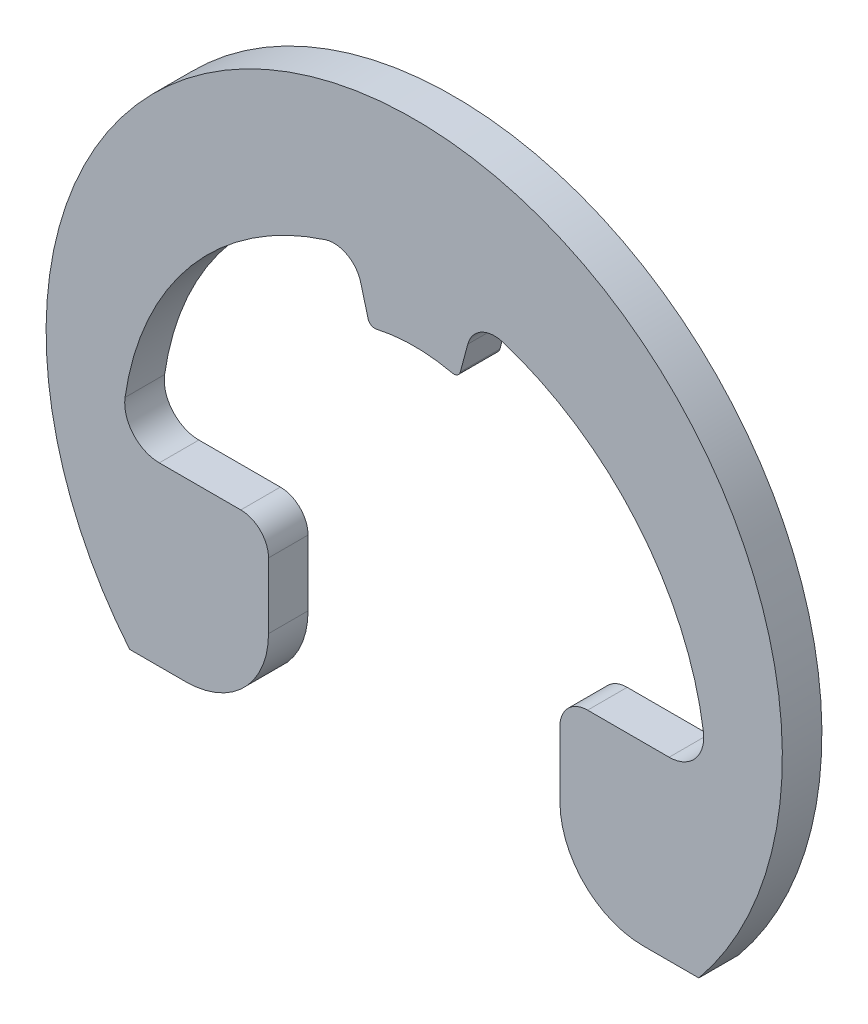
ISO-10303-21;
HEADER;
FILE_DESCRIPTION(('STEP AP214'),'2;1');
FILE_NAME('part.step','',(''),(''),'','','');
FILE_SCHEMA(('AUTOMOTIVE_DESIGN { 1 0 10303 214 1 1 1 1 }'));
ENDSEC;
DATA;
#1=APPLICATION_CONTEXT('core data for automotive mechanical design processes');
#2=APPLICATION_PROTOCOL_DEFINITION('international standard','automotive_design',2000,#1);
#3=PRODUCT_CONTEXT('',#1,'mechanical');
#4=PRODUCT('Part','Part','',(#3));
#5=PRODUCT_RELATED_PRODUCT_CATEGORY('part','',(#4));
#6=PRODUCT_DEFINITION_FORMATION('','',#4);
#7=PRODUCT_DEFINITION_CONTEXT('part definition',#1,'design');
#8=PRODUCT_DEFINITION('design','',#6,#7);
#9=PRODUCT_DEFINITION_SHAPE('','',#8);
#10=(LENGTH_UNIT() NAMED_UNIT(*) SI_UNIT(.MILLI.,.METRE.));
#11=(NAMED_UNIT(*) PLANE_ANGLE_UNIT() SI_UNIT($,.RADIAN.));
#12=(NAMED_UNIT(*) SI_UNIT($,.STERADIAN.) SOLID_ANGLE_UNIT());
#13=UNCERTAINTY_MEASURE_WITH_UNIT(LENGTH_MEASURE(1.E-05),#10,'distance_accuracy_value','');
#14=(GEOMETRIC_REPRESENTATION_CONTEXT(3) GLOBAL_UNCERTAINTY_ASSIGNED_CONTEXT((#13)) GLOBAL_UNIT_ASSIGNED_CONTEXT((#10,
#11,#12)) REPRESENTATION_CONTEXT('',''));
#15=CARTESIAN_POINT('',(0.,0.,0.));
#16=DIRECTION('',(0.,0.,1.));
#17=DIRECTION('',(1.,0.,0.));
#18=AXIS2_PLACEMENT_3D('',#15,#16,#17);
#19=CARTESIAN_POINT('',(-8.375,0.,0.450000000000002));
#20=DIRECTION('',(0.,0.,1.));
#21=DIRECTION('',(1.,0.,0.));
#22=AXIS2_PLACEMENT_3D('',#19,#20,#21);
#23=PLANE('',#22);
#24=CARTESIAN_POINT('',(0.,0.,0.450000000000002));
#25=DIRECTION('',(0.,0.,-1.));
#26=DIRECTION('',(-1.,0.,0.));
#27=AXIS2_PLACEMENT_3D('',#24,#25,#26);
#28=CIRCLE('',#27,3.9);
#29=CARTESIAN_POINT('',(-0.862405574002125,3.80345325013074,0.450000000000002));
#30=VERTEX_POINT('',#29);
#31=CARTESIAN_POINT('',(0.862405574002125,3.80345325013074,0.450000000000002));
#32=VERTEX_POINT('',#31);
#33=EDGE_CURVE('E322',#30,#32,#28,.T.);
#34=ORIENTED_EDGE('',*,*,#33,.T.);
#35=CARTESIAN_POINT('',(0.897233491413749,3.95705424677063,0.450000000000001));
#36=DIRECTION('',(0.,0.,1.));
#37=DIRECTION('',(1.,0.,0.));
#38=AXIS2_PLACEMENT_3D('',#35,#36,#37);
#39=CIRCLE('',#38,0.1575);
#40=CARTESIAN_POINT('',(1.04936680905428,3.91629024716699,0.450000000000002));
#41=VERTEX_POINT('',#40);
#42=EDGE_CURVE('E303',#32,#41,#39,.T.);
#43=ORIENTED_EDGE('',*,*,#42,.T.);
#44=DIRECTION('',(0.258819045102521,0.965925826289068,0.));
#45=VECTOR('',#44,1.);
#46=CARTESIAN_POINT('',(1.38111197343501,5.15438005580115,0.450000000000002));
#47=LINE('',#46,#45);
#48=CARTESIAN_POINT('',(1.2187214963885,4.54833054479825,0.450000000000002));
#49=VERTEX_POINT('',#48);
#50=EDGE_CURVE('E320',#41,#49,#47,.T.);
#51=ORIENTED_EDGE('',*,*,#50,.T.);
#52=CARTESIAN_POINT('',(1.82725476695061,4.38527454638366,0.45));
#53=DIRECTION('',(0.,0.,1.));
#54=DIRECTION('',(1.,0.,0.));
#55=AXIS2_PLACEMENT_3D('',#52,#53,#54);
#56=CIRCLE('',#55,0.63);
#57=CARTESIAN_POINT('',(2.01858591236094,4.98551815759162,0.450000000000002));
#58=VERTEX_POINT('',#57);
#59=EDGE_CURVE('E257',#49,#58,#56,.F.);
#60=ORIENTED_EDGE('',*,*,#59,.T.);
#61=CARTESIAN_POINT('',(0.,-1.34718473283745,0.450000000000002));
#62=DIRECTION('',(0.,0.,-1.));
#63=DIRECTION('',(-1.,0.,0.));
#64=AXIS2_PLACEMENT_3D('',#61,#62,#63);
#65=CIRCLE('',#64,6.6466393752054);
#66=CARTESIAN_POINT('',(6.57884872414697,-0.400313860531958,0.450000000000002));
#67=VERTEX_POINT('',#66);
#68=EDGE_CURVE('E325',#58,#67,#65,.T.);
#69=ORIENTED_EDGE('',*,*,#68,.T.);
#70=CARTESIAN_POINT('',(5.79938062338129,-0.5125,0.45));
#71=DIRECTION('',(0.,0.,1.));
#72=DIRECTION('',(1.,0.,0.));
#73=AXIS2_PLACEMENT_3D('',#70,#71,#72);
#74=CIRCLE('',#73,0.7875);
#75=CARTESIAN_POINT('',(5.79938062338129,-1.3,0.450000000000002));
#76=VERTEX_POINT('',#75);
#77=EDGE_CURVE('E272',#67,#76,#74,.F.);
#78=ORIENTED_EDGE('',*,*,#77,.T.);
#79=DIRECTION('',(-1.,0.,0.));
#80=VECTOR('',#79,1.);
#81=CARTESIAN_POINT('',(6.64647189003443,-1.3,0.450000000000002));
#82=LINE('',#81,#80);
#83=CARTESIAN_POINT('',(3.945,-1.3,0.450000000000002));
#84=VERTEX_POINT('',#83);
#85=EDGE_CURVE('E328',#76,#84,#82,.T.);
#86=ORIENTED_EDGE('',*,*,#85,.T.);
#87=CARTESIAN_POINT('',(3.945,-1.93,0.45));
#88=DIRECTION('',(0.,0.,1.));
#89=DIRECTION('',(1.,0.,0.));
#90=AXIS2_PLACEMENT_3D('',#87,#88,#89);
#91=CIRCLE('',#90,0.63);
#92=CARTESIAN_POINT('',(3.315,-1.93,0.450000000000002));
#93=VERTEX_POINT('',#92);
#94=EDGE_CURVE('E227',#84,#93,#91,.T.);
#95=ORIENTED_EDGE('',*,*,#94,.T.);
#96=DIRECTION('',(0.,-1.,0.));
#97=VECTOR('',#96,1.);
#98=CARTESIAN_POINT('',(3.315,-1.3,0.450000000000002));
#99=LINE('',#98,#97);
#100=CARTESIAN_POINT('',(3.315,-3.4225,0.450000000000002));
#101=VERTEX_POINT('',#100);
#102=EDGE_CURVE('E335',#93,#101,#99,.T.);
#103=ORIENTED_EDGE('',*,*,#102,.T.);
#104=CARTESIAN_POINT('',(5.205,-3.4225,0.45));
#105=DIRECTION('',(0.,0.,1.));
#106=DIRECTION('',(1.,0.,0.));
#107=AXIS2_PLACEMENT_3D('',#104,#105,#106);
#108=CIRCLE('',#107,1.89);
#109=CARTESIAN_POINT('',(5.205,-5.3125,0.450000000000002));
#110=VERTEX_POINT('',#109);
#111=EDGE_CURVE('E285',#101,#110,#108,.T.);
#112=ORIENTED_EDGE('',*,*,#111,.T.);
#113=DIRECTION('',(1.,0.,0.));
#114=VECTOR('',#113,1.);
#115=CARTESIAN_POINT('',(3.315,-5.3125,0.450000000000002));
#116=LINE('',#115,#114);
#117=CARTESIAN_POINT('',(6.47440875679008,-5.3125,0.450000000000002));
#118=VERTEX_POINT('',#117);
#119=EDGE_CURVE('E217',#110,#118,#116,.T.);
#120=ORIENTED_EDGE('',*,*,#119,.T.);
#121=CARTESIAN_POINT('',(0.,0.,0.45));
#122=DIRECTION('',(0.,0.,-1.));
#123=DIRECTION('',(-1.,0.,0.));
#124=AXIS2_PLACEMENT_3D('',#121,#122,#123);
#125=CIRCLE('',#124,8.375);
#126=CARTESIAN_POINT('',(-6.47440875679008,-5.3125,0.450000000000002));
#127=VERTEX_POINT('',#126);
#128=EDGE_CURVE('E209',#127,#118,#125,.T.);
#129=ORIENTED_EDGE('',*,*,#128,.F.);
#130=DIRECTION('',(1.,0.,0.));
#131=VECTOR('',#130,1.);
#132=CARTESIAN_POINT('',(-3.315,-5.3125,0.450000000000002));
#133=LINE('',#132,#131);
#134=CARTESIAN_POINT('',(-5.205,-5.3125,0.450000000000002));
#135=VERTEX_POINT('',#134);
#136=EDGE_CURVE('E192',#127,#135,#133,.T.);
#137=ORIENTED_EDGE('',*,*,#136,.T.);
#138=CARTESIAN_POINT('',(-5.205,-3.4225,0.450000000000002));
#139=DIRECTION('',(0.,0.,1.));
#140=DIRECTION('',(1.,0.,0.));
#141=AXIS2_PLACEMENT_3D('',#138,#139,#140);
#142=CIRCLE('',#141,1.89);
#143=CARTESIAN_POINT('',(-3.315,-3.4225,0.450000000000002));
#144=VERTEX_POINT('',#143);
#145=EDGE_CURVE('E283',#135,#144,#142,.T.);
#146=ORIENTED_EDGE('',*,*,#145,.T.);
#147=DIRECTION('',(0.,1.,0.));
#148=VECTOR('',#147,1.);
#149=CARTESIAN_POINT('',(-3.315,-2.05445248180628,0.450000000000002));
#150=LINE('',#149,#148);
#151=CARTESIAN_POINT('',(-3.315,-1.93,0.450000000000002));
#152=VERTEX_POINT('',#151);
#153=EDGE_CURVE('E202',#144,#152,#150,.T.);
#154=ORIENTED_EDGE('',*,*,#153,.T.);
#155=CARTESIAN_POINT('',(-3.945,-1.93,0.450000000000001));
#156=DIRECTION('',(0.,0.,1.));
#157=DIRECTION('',(1.,0.,0.));
#158=AXIS2_PLACEMENT_3D('',#155,#156,#157);
#159=CIRCLE('',#158,0.63);
#160=CARTESIAN_POINT('',(-3.945,-1.3,0.450000000000002));
#161=VERTEX_POINT('',#160);
#162=EDGE_CURVE('E222',#152,#161,#159,.T.);
#163=ORIENTED_EDGE('',*,*,#162,.T.);
#164=DIRECTION('',(-1.,0.,0.));
#165=VECTOR('',#164,1.);
#166=CARTESIAN_POINT('',(-3.67695526217005,-1.3,0.450000000000002));
#167=LINE('',#166,#165);
#168=CARTESIAN_POINT('',(-5.79938062338129,-1.3,0.450000000000002));
#169=VERTEX_POINT('',#168);
#170=EDGE_CURVE('E374',#161,#169,#167,.T.);
#171=ORIENTED_EDGE('',*,*,#170,.T.);
#172=CARTESIAN_POINT('',(-5.79938062338129,-0.5125,0.450000000000002));
#173=DIRECTION('',(0.,0.,1.));
#174=DIRECTION('',(1.,0.,0.));
#175=AXIS2_PLACEMENT_3D('',#172,#173,#174);
#176=CIRCLE('',#175,0.7875);
#177=CARTESIAN_POINT('',(-6.57884872414697,-0.400313860531958,0.450000000000002));
#178=VERTEX_POINT('',#177);
#179=EDGE_CURVE('E276',#169,#178,#176,.F.);
#180=ORIENTED_EDGE('',*,*,#179,.T.);
#181=CARTESIAN_POINT('',(0.,-1.34718473283745,0.450000000000002));
#182=DIRECTION('',(0.,0.,-1.));
#183=DIRECTION('',(1.,0.,0.));
#184=AXIS2_PLACEMENT_3D('',#181,#182,#183);
#185=CIRCLE('',#184,6.6466393752054);
#186=CARTESIAN_POINT('',(-2.01858591236094,4.98551815759162,0.450000000000002));
#187=VERTEX_POINT('',#186);
#188=EDGE_CURVE('E377',#178,#187,#185,.T.);
#189=ORIENTED_EDGE('',*,*,#188,.T.);
#190=CARTESIAN_POINT('',(-1.82725476695061,4.38527454638366,0.450000000000001));
#191=DIRECTION('',(0.,0.,1.));
#192=DIRECTION('',(1.,0.,0.));
#193=AXIS2_PLACEMENT_3D('',#190,#191,#192);
#194=CIRCLE('',#193,0.63);
#195=CARTESIAN_POINT('',(-1.2187214963885,4.54833054479825,0.450000000000002));
#196=VERTEX_POINT('',#195);
#197=EDGE_CURVE('E252',#187,#196,#194,.F.);
#198=ORIENTED_EDGE('',*,*,#197,.T.);
#199=DIRECTION('',(0.258819045102521,-0.965925826289068,0.));
#200=VECTOR('',#199,1.);
#201=CARTESIAN_POINT('',(-1.38111197343501,5.15438005580115,0.450000000000002));
#202=LINE('',#201,#200);
#203=CARTESIAN_POINT('',(-1.04936680905428,3.91629024716699,0.450000000000002));
#204=VERTEX_POINT('',#203);
#205=EDGE_CURVE('E330',#196,#204,#202,.T.);
#206=ORIENTED_EDGE('',*,*,#205,.T.);
#207=CARTESIAN_POINT('',(-0.897233491413749,3.95705424677063,0.450000000000001));
#208=DIRECTION('',(0.,0.,1.));
#209=DIRECTION('',(1.,0.,0.));
#210=AXIS2_PLACEMENT_3D('',#207,#208,#209);
#211=CIRCLE('',#210,0.1575);
#212=EDGE_CURVE('E301',#204,#30,#211,.T.);
#213=ORIENTED_EDGE('',*,*,#212,.T.);
#214=EDGE_LOOP('',(#34,#43,#51,#60,#69,#78,#86,#95,#103,#112,#120,#129,#137,#146,#154,#163,#171,
#180,#189,#198,#206,#213));
#215=FACE_BOUND('',#214,.T.);
#216=ADVANCED_FACE('F40',(#215),#23,.T.);
#217=CARTESIAN_POINT('',(0.,0.,-0.450000000000002));
#218=DIRECTION('',(0.,0.,-1.));
#219=DIRECTION('',(-1.,0.,0.));
#220=AXIS2_PLACEMENT_3D('',#217,#218,#219);
#221=CYLINDRICAL_SURFACE('',#220,8.375);
#222=ORIENTED_EDGE('',*,*,#128,.T.);
#223=DIRECTION('',(0.,0.,1.));
#224=VECTOR('',#223,1.);
#225=CARTESIAN_POINT('',(6.47440875679008,-5.3125,-0.449999999999998));
#226=LINE('',#225,#224);
#227=CARTESIAN_POINT('',(6.47440875679008,-5.3125,-0.449999999999998));
#228=VERTEX_POINT('',#227);
#229=EDGE_CURVE('E212',#228,#118,#226,.T.);
#230=ORIENTED_EDGE('',*,*,#229,.F.);
#231=CARTESIAN_POINT('',(0.,0.,-0.45));
#232=DIRECTION('',(0.,0.,-1.));
#233=DIRECTION('',(-1.,0.,0.));
#234=AXIS2_PLACEMENT_3D('',#231,#232,#233);
#235=CIRCLE('',#234,8.375);
#236=CARTESIAN_POINT('',(-6.47440875679008,-5.3125,-0.449999999999999));
#237=VERTEX_POINT('',#236);
#238=EDGE_CURVE('E211',#237,#228,#235,.T.);
#239=ORIENTED_EDGE('',*,*,#238,.F.);
#240=DIRECTION('',(0.,0.,1.));
#241=VECTOR('',#240,1.);
#242=CARTESIAN_POINT('',(-6.47440875679008,-5.3125,-0.449999999999998));
#243=LINE('',#242,#241);
#244=EDGE_CURVE('E196',#237,#127,#243,.T.);
#245=ORIENTED_EDGE('',*,*,#244,.T.);
#246=EDGE_LOOP('',(#222,#230,#239,#245));
#247=FACE_BOUND('',#246,.T.);
#248=ADVANCED_FACE('F207',(#247),#221,.T.);
#249=CARTESIAN_POINT('',(-8.375,0.,-0.449999999999999));
#250=DIRECTION('',(0.,0.,-1.));
#251=DIRECTION('',(-1.,0.,0.));
#252=AXIS2_PLACEMENT_3D('',#249,#250,#251);
#253=PLANE('',#252);
#254=DIRECTION('',(0.258819045102521,0.965925826289068,0.));
#255=VECTOR('',#254,1.);
#256=CARTESIAN_POINT('',(1.38111197343501,5.15438005580115,-0.449999999999998));
#257=LINE('',#256,#255);
#258=CARTESIAN_POINT('',(1.04936680905428,3.91629024716699,-0.449999999999998));
#259=VERTEX_POINT('',#258);
#260=CARTESIAN_POINT('',(1.2187214963885,4.54833054479825,-0.449999999999998));
#261=VERTEX_POINT('',#260);
#262=EDGE_CURVE('E310',#259,#261,#257,.T.);
#263=ORIENTED_EDGE('',*,*,#262,.F.);
#264=CARTESIAN_POINT('',(0.897233491413749,3.95705424677063,-0.450000000000001));
#265=DIRECTION('',(0.,0.,-1.));
#266=DIRECTION('',(-1.,0.,0.));
#267=AXIS2_PLACEMENT_3D('',#264,#265,#266);
#268=CIRCLE('',#267,0.1575);
#269=CARTESIAN_POINT('',(0.862405574002125,3.80345325013074,-0.449999999999998));
#270=VERTEX_POINT('',#269);
#271=EDGE_CURVE('E48',#259,#270,#268,.T.);
#272=ORIENTED_EDGE('',*,*,#271,.T.);
#273=CARTESIAN_POINT('',(0.,0.,-0.449999999999998));
#274=DIRECTION('',(0.,0.,-1.));
#275=DIRECTION('',(-1.,0.,0.));
#276=AXIS2_PLACEMENT_3D('',#273,#274,#275);
#277=CIRCLE('',#276,3.9);
#278=CARTESIAN_POINT('',(-0.862405574002125,3.80345325013074,-0.449999999999998));
#279=VERTEX_POINT('',#278);
#280=EDGE_CURVE('E309',#279,#270,#277,.T.);
#281=ORIENTED_EDGE('',*,*,#280,.F.);
#282=CARTESIAN_POINT('',(-0.897233491413749,3.95705424677063,-0.450000000000001));
#283=DIRECTION('',(0.,0.,-1.));
#284=DIRECTION('',(-1.,0.,0.));
#285=AXIS2_PLACEMENT_3D('',#282,#283,#284);
#286=CIRCLE('',#285,0.1575);
#287=CARTESIAN_POINT('',(-1.04936680905428,3.91629024716699,-0.449999999999998));
#288=VERTEX_POINT('',#287);
#289=EDGE_CURVE('E55',#279,#288,#286,.T.);
#290=ORIENTED_EDGE('',*,*,#289,.T.);
#291=DIRECTION('',(0.258819045102521,-0.965925826289068,0.));
#292=VECTOR('',#291,1.);
#293=CARTESIAN_POINT('',(-1.38111197343501,5.15438005580115,-0.449999999999998));
#294=LINE('',#293,#292);
#295=CARTESIAN_POINT('',(-1.2187214963885,4.54833054479825,-0.449999999999998));
#296=VERTEX_POINT('',#295);
#297=EDGE_CURVE('E317',#296,#288,#294,.T.);
#298=ORIENTED_EDGE('',*,*,#297,.F.);
#299=CARTESIAN_POINT('',(-1.82725476695061,4.38527454638366,-0.45));
#300=DIRECTION('',(0.,0.,-1.));
#301=DIRECTION('',(-1.,0.,0.));
#302=AXIS2_PLACEMENT_3D('',#299,#300,#301);
#303=CIRCLE('',#302,0.63);
#304=CARTESIAN_POINT('',(-2.01858591236094,4.98551815759162,-0.449999999999998));
#305=VERTEX_POINT('',#304);
#306=EDGE_CURVE('E254',#296,#305,#303,.F.);
#307=ORIENTED_EDGE('',*,*,#306,.T.);
#308=CARTESIAN_POINT('',(0.,-1.34718473283745,-0.449999999999998));
#309=DIRECTION('',(0.,0.,-1.));
#310=DIRECTION('',(1.,0.,0.));
#311=AXIS2_PLACEMENT_3D('',#308,#309,#310);
#312=CIRCLE('',#311,6.6466393752054);
#313=CARTESIAN_POINT('',(-6.57884872414697,-0.400313860531958,-0.449999999999998));
#314=VERTEX_POINT('',#313);
#315=EDGE_CURVE('E346',#314,#305,#312,.T.);
#316=ORIENTED_EDGE('',*,*,#315,.F.);
#317=CARTESIAN_POINT('',(-5.79938062338129,-0.5125,-0.45));
#318=DIRECTION('',(0.,0.,-1.));
#319=DIRECTION('',(-1.,0.,0.));
#320=AXIS2_PLACEMENT_3D('',#317,#318,#319);
#321=CIRCLE('',#320,0.7875);
#322=CARTESIAN_POINT('',(-5.79938062338129,-1.3,-0.449999999999998));
#323=VERTEX_POINT('',#322);
#324=EDGE_CURVE('E278',#314,#323,#321,.F.);
#325=ORIENTED_EDGE('',*,*,#324,.T.);
#326=DIRECTION('',(-1.,0.,0.));
#327=VECTOR('',#326,1.);
#328=CARTESIAN_POINT('',(-3.67695526217005,-1.3,-0.449999999999998));
#329=LINE('',#328,#327);
#330=CARTESIAN_POINT('',(-3.945,-1.3,-0.449999999999998));
#331=VERTEX_POINT('',#330);
#332=EDGE_CURVE('E343',#331,#323,#329,.T.);
#333=ORIENTED_EDGE('',*,*,#332,.F.);
#334=CARTESIAN_POINT('',(-3.945,-1.93,-0.45));
#335=DIRECTION('',(0.,0.,-1.));
#336=DIRECTION('',(-1.,0.,0.));
#337=AXIS2_PLACEMENT_3D('',#334,#335,#336);
#338=CIRCLE('',#337,0.63);
#339=CARTESIAN_POINT('',(-3.315,-1.93,-0.449999999999998));
#340=VERTEX_POINT('',#339);
#341=EDGE_CURVE('E231',#331,#340,#338,.T.);
#342=ORIENTED_EDGE('',*,*,#341,.T.);
#343=DIRECTION('',(0.,1.,0.));
#344=VECTOR('',#343,1.);
#345=CARTESIAN_POINT('',(-3.315,-2.05445248180628,-0.449999999999998));
#346=LINE('',#345,#344);
#347=CARTESIAN_POINT('',(-3.315,-3.4225,-0.449999999999998));
#348=VERTEX_POINT('',#347);
#349=EDGE_CURVE('E341',#348,#340,#346,.T.);
#350=ORIENTED_EDGE('',*,*,#349,.F.);
#351=CARTESIAN_POINT('',(-5.205,-3.4225,-0.45));
#352=DIRECTION('',(0.,0.,-1.));
#353=DIRECTION('',(-1.,0.,0.));
#354=AXIS2_PLACEMENT_3D('',#351,#352,#353);
#355=CIRCLE('',#354,1.89);
#356=CARTESIAN_POINT('',(-5.205,-5.3125,-0.449999999999998));
#357=VERTEX_POINT('',#356);
#358=EDGE_CURVE('E289',#348,#357,#355,.T.);
#359=ORIENTED_EDGE('',*,*,#358,.T.);
#360=DIRECTION('',(1.,0.,0.));
#361=VECTOR('',#360,1.);
#362=CARTESIAN_POINT('',(-3.315,-5.3125,-0.449999999999998));
#363=LINE('',#362,#361);
#364=EDGE_CURVE('E339',#237,#357,#363,.T.);
#365=ORIENTED_EDGE('',*,*,#364,.F.);
#366=ORIENTED_EDGE('',*,*,#238,.T.);
#367=DIRECTION('',(1.,0.,0.));
#368=VECTOR('',#367,1.);
#369=CARTESIAN_POINT('',(3.315,-5.3125,-0.449999999999998));
#370=LINE('',#369,#368);
#371=CARTESIAN_POINT('',(5.205,-5.3125,-0.449999999999998));
#372=VERTEX_POINT('',#371);
#373=EDGE_CURVE('E213',#372,#228,#370,.T.);
#374=ORIENTED_EDGE('',*,*,#373,.F.);
#375=CARTESIAN_POINT('',(5.205,-3.4225,-0.450000000000002));
#376=DIRECTION('',(0.,0.,-1.));
#377=DIRECTION('',(-1.,0.,0.));
#378=AXIS2_PLACEMENT_3D('',#375,#376,#377);
#379=CIRCLE('',#378,1.89);
#380=CARTESIAN_POINT('',(3.315,-3.4225,-0.449999999999998));
#381=VERTEX_POINT('',#380);
#382=EDGE_CURVE('E291',#372,#381,#379,.T.);
#383=ORIENTED_EDGE('',*,*,#382,.T.);
#384=DIRECTION('',(0.,-1.,0.));
#385=VECTOR('',#384,1.);
#386=CARTESIAN_POINT('',(3.315,-1.3,-0.449999999999998));
#387=LINE('',#386,#385);
#388=CARTESIAN_POINT('',(3.315,-1.93,-0.449999999999998));
#389=VERTEX_POINT('',#388);
#390=EDGE_CURVE('E355',#389,#381,#387,.T.);
#391=ORIENTED_EDGE('',*,*,#390,.F.);
#392=CARTESIAN_POINT('',(3.945,-1.93,-0.450000000000002));
#393=DIRECTION('',(0.,0.,-1.));
#394=DIRECTION('',(-1.,0.,0.));
#395=AXIS2_PLACEMENT_3D('',#392,#393,#394);
#396=CIRCLE('',#395,0.63);
#397=CARTESIAN_POINT('',(3.945,-1.3,-0.449999999999998));
#398=VERTEX_POINT('',#397);
#399=EDGE_CURVE('E234',#389,#398,#396,.T.);
#400=ORIENTED_EDGE('',*,*,#399,.T.);
#401=DIRECTION('',(-1.,0.,0.));
#402=VECTOR('',#401,1.);
#403=CARTESIAN_POINT('',(6.64647189003443,-1.3,-0.449999999999998));
#404=LINE('',#403,#402);
#405=CARTESIAN_POINT('',(5.79938062338129,-1.3,-0.449999999999998));
#406=VERTEX_POINT('',#405);
#407=EDGE_CURVE('E353',#406,#398,#404,.T.);
#408=ORIENTED_EDGE('',*,*,#407,.F.);
#409=CARTESIAN_POINT('',(5.79938062338129,-0.5125,-0.450000000000002));
#410=DIRECTION('',(0.,0.,-1.));
#411=DIRECTION('',(-1.,0.,0.));
#412=AXIS2_PLACEMENT_3D('',#409,#410,#411);
#413=CIRCLE('',#412,0.7875);
#414=CARTESIAN_POINT('',(6.57884872414697,-0.400313860531958,-0.449999999999998));
#415=VERTEX_POINT('',#414);
#416=EDGE_CURVE('E274',#406,#415,#413,.F.);
#417=ORIENTED_EDGE('',*,*,#416,.T.);
#418=CARTESIAN_POINT('',(0.,-1.34718473283745,-0.449999999999998));
#419=DIRECTION('',(0.,0.,-1.));
#420=DIRECTION('',(-1.,0.,0.));
#421=AXIS2_PLACEMENT_3D('',#418,#419,#420);
#422=CIRCLE('',#421,6.6466393752054);
#423=CARTESIAN_POINT('',(2.01858591236094,4.98551815759162,-0.449999999999998));
#424=VERTEX_POINT('',#423);
#425=EDGE_CURVE('E350',#424,#415,#422,.T.);
#426=ORIENTED_EDGE('',*,*,#425,.F.);
#427=CARTESIAN_POINT('',(1.82725476695061,4.38527454638366,-0.450000000000001));
#428=DIRECTION('',(0.,0.,-1.));
#429=DIRECTION('',(-1.,0.,0.));
#430=AXIS2_PLACEMENT_3D('',#427,#428,#429);
#431=CIRCLE('',#430,0.63);
#432=EDGE_CURVE('E259',#424,#261,#431,.F.);
#433=ORIENTED_EDGE('',*,*,#432,.T.);
#434=EDGE_LOOP('',(#263,#272,#281,#290,#298,#307,#316,#325,#333,#342,#350,#359,#365,#366,#374,
#383,#391,#400,#408,#417,#426,#433));
#435=FACE_BOUND('',#434,.T.);
#436=ADVANCED_FACE('F308',(#435),#253,.T.);
#437=CARTESIAN_POINT('',(3.315,-5.3125,-0.449999999999998));
#438=DIRECTION('',(0.,-1.,0.));
#439=DIRECTION('',(0.,0.,-1.));
#440=AXIS2_PLACEMENT_3D('',#437,#438,#439);
#441=PLANE('',#440);
#442=ORIENTED_EDGE('',*,*,#119,.F.);
#443=DIRECTION('',(0.,0.,1.));
#444=VECTOR('',#443,1.);
#445=CARTESIAN_POINT('',(5.205,-5.3125,-0.449999999999998));
#446=LINE('',#445,#444);
#447=EDGE_CURVE('E287',#110,#372,#446,.F.);
#448=ORIENTED_EDGE('',*,*,#447,.T.);
#449=ORIENTED_EDGE('',*,*,#373,.T.);
#450=ORIENTED_EDGE('',*,*,#229,.T.);
#451=EDGE_LOOP('',(#442,#448,#449,#450));
#452=FACE_BOUND('',#451,.T.);
#453=ADVANCED_FACE('F360',(#452),#441,.T.);
#454=CARTESIAN_POINT('',(3.315,-2.05445248180628,-0.449999999999998));
#455=DIRECTION('',(-1.,0.,0.));
#456=DIRECTION('',(0.,-1.,0.));
#457=AXIS2_PLACEMENT_3D('',#454,#455,#456);
#458=PLANE('',#457);
#459=ORIENTED_EDGE('',*,*,#390,.T.);
#460=DIRECTION('',(0.,0.,1.));
#461=VECTOR('',#460,1.);
#462=CARTESIAN_POINT('',(3.315,-3.4225,-0.449999999999998));
#463=LINE('',#462,#461);
#464=EDGE_CURVE('E280',#381,#101,#463,.T.);
#465=ORIENTED_EDGE('',*,*,#464,.T.);
#466=ORIENTED_EDGE('',*,*,#102,.F.);
#467=DIRECTION('',(0.,0.,1.));
#468=VECTOR('',#467,1.);
#469=CARTESIAN_POINT('',(3.315,-1.93,-0.449999999999998));
#470=LINE('',#469,#468);
#471=EDGE_CURVE('E229',#93,#389,#470,.F.);
#472=ORIENTED_EDGE('',*,*,#471,.T.);
#473=EDGE_LOOP('',(#459,#465,#466,#472));
#474=FACE_BOUND('',#473,.T.);
#475=ADVANCED_FACE('F460',(#474),#458,.T.);
#476=CARTESIAN_POINT('',(3.67695526217005,-1.3,-0.449999999999998));
#477=DIRECTION('',(0.,1.,0.));
#478=DIRECTION('',(0.,0.,1.));
#479=AXIS2_PLACEMENT_3D('',#476,#477,#478);
#480=PLANE('',#479);
#481=ORIENTED_EDGE('',*,*,#85,.F.);
#482=DIRECTION('',(0.,0.,-1.));
#483=VECTOR('',#482,1.);
#484=CARTESIAN_POINT('',(5.79938062338129,-1.3,-0.449999999999998));
#485=LINE('',#484,#483);
#486=EDGE_CURVE('E265',#76,#406,#485,.T.);
#487=ORIENTED_EDGE('',*,*,#486,.T.);
#488=ORIENTED_EDGE('',*,*,#407,.T.);
#489=DIRECTION('',(0.,0.,1.));
#490=VECTOR('',#489,1.);
#491=CARTESIAN_POINT('',(3.945,-1.3,-0.449999999999998));
#492=LINE('',#491,#490);
#493=EDGE_CURVE('E219',#398,#84,#492,.T.);
#494=ORIENTED_EDGE('',*,*,#493,.T.);
#495=EDGE_LOOP('',(#481,#487,#488,#494));
#496=FACE_BOUND('',#495,.T.);
#497=ADVANCED_FACE('F464',(#496),#480,.T.);
#498=CARTESIAN_POINT('',(0.,-1.34718473283745,-0.449999999999998));
#499=DIRECTION('',(0.,0.,1.));
#500=DIRECTION('',(1.,0.,0.));
#501=AXIS2_PLACEMENT_3D('',#498,#499,#500);
#502=CYLINDRICAL_SURFACE('',#501,6.6466393752054);
#503=ORIENTED_EDGE('',*,*,#425,.T.);
#504=DIRECTION('',(0.,0.,1.));
#505=VECTOR('',#504,1.);
#506=CARTESIAN_POINT('',(6.57884872414697,-0.400313860531958,-0.449999999999998));
#507=LINE('',#506,#505);
#508=EDGE_CURVE('E262',#415,#67,#507,.T.);
#509=ORIENTED_EDGE('',*,*,#508,.T.);
#510=ORIENTED_EDGE('',*,*,#68,.F.);
#511=DIRECTION('',(0.,0.,1.));
#512=VECTOR('',#511,1.);
#513=CARTESIAN_POINT('',(2.01858591236094,4.98551815759162,-0.449999999999998));
#514=LINE('',#513,#512);
#515=EDGE_CURVE('E250',#58,#424,#514,.F.);
#516=ORIENTED_EDGE('',*,*,#515,.T.);
#517=EDGE_LOOP('',(#503,#509,#510,#516));
#518=FACE_BOUND('',#517,.T.);
#519=ADVANCED_FACE('F502',(#518),#502,.F.);
#520=CARTESIAN_POINT('',(1.38111197343501,5.15438005580115,-0.449999999999998));
#521=DIRECTION('',(0.965925826289068,-0.258819045102521,0.));
#522=DIRECTION('',(0.258819045102521,0.965925826289068,0.));
#523=AXIS2_PLACEMENT_3D('',#520,#521,#522);
#524=PLANE('',#523);
#525=ORIENTED_EDGE('',*,*,#50,.F.);
#526=DIRECTION('',(0.,0.,1.));
#527=VECTOR('',#526,1.);
#528=CARTESIAN_POINT('',(1.04936680905428,3.91629024716699,-0.449999999999998));
#529=LINE('',#528,#527);
#530=EDGE_CURVE('E63',#41,#259,#529,.F.);
#531=ORIENTED_EDGE('',*,*,#530,.T.);
#532=ORIENTED_EDGE('',*,*,#262,.T.);
#533=DIRECTION('',(0.,0.,-1.));
#534=VECTOR('',#533,1.);
#535=CARTESIAN_POINT('',(1.2187214963885,4.54833054479825,0.450000000000002));
#536=LINE('',#535,#534);
#537=EDGE_CURVE('E247',#261,#49,#536,.F.);
#538=ORIENTED_EDGE('',*,*,#537,.T.);
#539=EDGE_LOOP('',(#525,#531,#532,#538));
#540=FACE_BOUND('',#539,.T.);
#541=ADVANCED_FACE('F323',(#540),#524,.T.);
#542=CARTESIAN_POINT('',(0.,0.,-0.449999999999998));
#543=DIRECTION('',(0.,0.,1.));
#544=DIRECTION('',(1.,0.,0.));
#545=AXIS2_PLACEMENT_3D('',#542,#543,#544);
#546=CYLINDRICAL_SURFACE('',#545,3.9);
#547=ORIENTED_EDGE('',*,*,#280,.T.);
#548=DIRECTION('',(0.,0.,1.));
#549=VECTOR('',#548,1.);
#550=CARTESIAN_POINT('',(0.862405574002125,3.80345325013074,-0.449999999999998));
#551=LINE('',#550,#549);
#552=EDGE_CURVE('E298',#270,#32,#551,.T.);
#553=ORIENTED_EDGE('',*,*,#552,.T.);
#554=ORIENTED_EDGE('',*,*,#33,.F.);
#555=DIRECTION('',(0.,0.,1.));
#556=VECTOR('',#555,1.);
#557=CARTESIAN_POINT('',(-0.862405574002125,3.80345325013074,-0.449999999999998));
#558=LINE('',#557,#556);
#559=EDGE_CURVE('E296',#30,#279,#558,.F.);
#560=ORIENTED_EDGE('',*,*,#559,.T.);
#561=EDGE_LOOP('',(#547,#553,#554,#560));
#562=FACE_BOUND('',#561,.T.);
#563=ADVANCED_FACE('F314',(#562),#546,.F.);
#564=CARTESIAN_POINT('',(-1.38111197343501,5.15438005580115,-0.449999999999998));
#565=DIRECTION('',(-0.965925826289068,-0.258819045102521,0.));
#566=DIRECTION('',(0.258819045102521,-0.965925826289068,0.));
#567=AXIS2_PLACEMENT_3D('',#564,#565,#566);
#568=PLANE('',#567);
#569=ORIENTED_EDGE('',*,*,#297,.T.);
#570=DIRECTION('',(0.,0.,1.));
#571=VECTOR('',#570,1.);
#572=CARTESIAN_POINT('',(-1.04936680905428,3.91629024716699,-0.449999999999998));
#573=LINE('',#572,#571);
#574=EDGE_CURVE('E12',#288,#204,#573,.T.);
#575=ORIENTED_EDGE('',*,*,#574,.T.);
#576=ORIENTED_EDGE('',*,*,#205,.F.);
#577=DIRECTION('',(0.,0.,-1.));
#578=VECTOR('',#577,1.);
#579=CARTESIAN_POINT('',(-1.2187214963885,4.54833054479825,-0.449999999999998));
#580=LINE('',#579,#578);
#581=EDGE_CURVE('E245',#196,#296,#580,.T.);
#582=ORIENTED_EDGE('',*,*,#581,.T.);
#583=EDGE_LOOP('',(#569,#575,#576,#582));
#584=FACE_BOUND('',#583,.T.);
#585=ADVANCED_FACE('F385',(#584),#568,.T.);
#586=CARTESIAN_POINT('',(0.,-1.34718473283745,-0.449999999999998));
#587=DIRECTION('',(0.,0.,1.));
#588=DIRECTION('',(1.,0.,0.));
#589=AXIS2_PLACEMENT_3D('',#586,#587,#588);
#590=CYLINDRICAL_SURFACE('',#589,6.6466393752054);
#591=ORIENTED_EDGE('',*,*,#188,.F.);
#592=DIRECTION('',(0.,0.,1.));
#593=VECTOR('',#592,1.);
#594=CARTESIAN_POINT('',(-6.57884872414697,-0.400313860531958,-0.449999999999998));
#595=LINE('',#594,#593);
#596=EDGE_CURVE('E270',#178,#314,#595,.F.);
#597=ORIENTED_EDGE('',*,*,#596,.T.);
#598=ORIENTED_EDGE('',*,*,#315,.T.);
#599=DIRECTION('',(0.,0.,1.));
#600=VECTOR('',#599,1.);
#601=CARTESIAN_POINT('',(-2.01858591236094,4.98551815759162,-0.449999999999998));
#602=LINE('',#601,#600);
#603=EDGE_CURVE('E242',#305,#187,#602,.T.);
#604=ORIENTED_EDGE('',*,*,#603,.T.);
#605=EDGE_LOOP('',(#591,#597,#598,#604));
#606=FACE_BOUND('',#605,.T.);
#607=ADVANCED_FACE('F488',(#606),#590,.F.);
#608=CARTESIAN_POINT('',(-6.64647189003443,-1.3,-0.449999999999998));
#609=DIRECTION('',(0.,1.,0.));
#610=DIRECTION('',(0.,0.,1.));
#611=AXIS2_PLACEMENT_3D('',#608,#609,#610);
#612=PLANE('',#611);
#613=ORIENTED_EDGE('',*,*,#332,.T.);
#614=DIRECTION('',(0.,0.,-1.));
#615=VECTOR('',#614,1.);
#616=CARTESIAN_POINT('',(-5.79938062338129,-1.3,0.450000000000002));
#617=LINE('',#616,#615);
#618=EDGE_CURVE('E267',#323,#169,#617,.F.);
#619=ORIENTED_EDGE('',*,*,#618,.T.);
#620=ORIENTED_EDGE('',*,*,#170,.F.);
#621=DIRECTION('',(0.,0.,1.));
#622=VECTOR('',#621,1.);
#623=CARTESIAN_POINT('',(-3.945,-1.3,-0.449999999999998));
#624=LINE('',#623,#622);
#625=EDGE_CURVE('E240',#161,#331,#624,.F.);
#626=ORIENTED_EDGE('',*,*,#625,.T.);
#627=EDGE_LOOP('',(#613,#619,#620,#626));
#628=FACE_BOUND('',#627,.T.);
#629=ADVANCED_FACE('F455',(#628),#612,.T.);
#630=CARTESIAN_POINT('',(-3.315,-1.3,-0.449999999999998));
#631=DIRECTION('',(1.,0.,0.));
#632=DIRECTION('',(0.,1.,0.));
#633=AXIS2_PLACEMENT_3D('',#630,#631,#632);
#634=PLANE('',#633);
#635=ORIENTED_EDGE('',*,*,#153,.F.);
#636=DIRECTION('',(0.,0.,1.));
#637=VECTOR('',#636,1.);
#638=CARTESIAN_POINT('',(-3.315,-3.4225,-0.449999999999998));
#639=LINE('',#638,#637);
#640=EDGE_CURVE('E294',#144,#348,#639,.F.);
#641=ORIENTED_EDGE('',*,*,#640,.T.);
#642=ORIENTED_EDGE('',*,*,#349,.T.);
#643=DIRECTION('',(0.,0.,1.));
#644=VECTOR('',#643,1.);
#645=CARTESIAN_POINT('',(-3.315,-1.93,-0.449999999999998));
#646=LINE('',#645,#644);
#647=EDGE_CURVE('E237',#340,#152,#646,.T.);
#648=ORIENTED_EDGE('',*,*,#647,.T.);
#649=EDGE_LOOP('',(#635,#641,#642,#648));
#650=FACE_BOUND('',#649,.T.);
#651=ADVANCED_FACE('F372',(#650),#634,.T.);
#652=CARTESIAN_POINT('',(-3.315,-5.3125,-0.449999999999998));
#653=DIRECTION('',(0.,-1.,0.));
#654=DIRECTION('',(0.,0.,-1.));
#655=AXIS2_PLACEMENT_3D('',#652,#653,#654);
#656=PLANE('',#655);
#657=ORIENTED_EDGE('',*,*,#364,.T.);
#658=DIRECTION('',(0.,0.,1.));
#659=VECTOR('',#658,1.);
#660=CARTESIAN_POINT('',(-5.205,-5.3125,-0.449999999999998));
#661=LINE('',#660,#659);
#662=EDGE_CURVE('E199',#357,#135,#661,.T.);
#663=ORIENTED_EDGE('',*,*,#662,.T.);
#664=ORIENTED_EDGE('',*,*,#136,.F.);
#665=ORIENTED_EDGE('',*,*,#244,.F.);
#666=EDGE_LOOP('',(#657,#663,#664,#665));
#667=FACE_BOUND('',#666,.T.);
#668=ADVANCED_FACE('F195',(#667),#656,.T.);
#669=CARTESIAN_POINT('',(3.945,-1.93,-0.449999999999998));
#670=DIRECTION('',(0.,0.,1.));
#671=DIRECTION('',(1.,0.,0.));
#672=AXIS2_PLACEMENT_3D('',#669,#670,#671);
#673=CYLINDRICAL_SURFACE('',#672,0.63);
#674=ORIENTED_EDGE('',*,*,#399,.F.);
#675=ORIENTED_EDGE('',*,*,#471,.F.);
#676=ORIENTED_EDGE('',*,*,#94,.F.);
#677=ORIENTED_EDGE('',*,*,#493,.F.);
#678=EDGE_LOOP('',(#674,#675,#676,#677));
#679=FACE_BOUND('',#678,.T.);
#680=ADVANCED_FACE('F408',(#679),#673,.T.);
#681=CARTESIAN_POINT('',(-3.945,-1.93,-0.449999999999998));
#682=DIRECTION('',(0.,0.,1.));
#683=DIRECTION('',(1.,0.,0.));
#684=AXIS2_PLACEMENT_3D('',#681,#682,#683);
#685=CYLINDRICAL_SURFACE('',#684,0.63);
#686=ORIENTED_EDGE('',*,*,#341,.F.);
#687=ORIENTED_EDGE('',*,*,#625,.F.);
#688=ORIENTED_EDGE('',*,*,#162,.F.);
#689=ORIENTED_EDGE('',*,*,#647,.F.);
#690=EDGE_LOOP('',(#686,#687,#688,#689));
#691=FACE_BOUND('',#690,.T.);
#692=ADVANCED_FACE('F411',(#691),#685,.T.);
#693=CARTESIAN_POINT('',(-1.82725476695061,4.38527454638366,-0.449999999999998));
#694=DIRECTION('',(0.,0.,1.));
#695=DIRECTION('',(1.,0.,0.));
#696=AXIS2_PLACEMENT_3D('',#693,#694,#695);
#697=CYLINDRICAL_SURFACE('',#696,0.63);
#698=ORIENTED_EDGE('',*,*,#306,.F.);
#699=ORIENTED_EDGE('',*,*,#581,.F.);
#700=ORIENTED_EDGE('',*,*,#197,.F.);
#701=ORIENTED_EDGE('',*,*,#603,.F.);
#702=EDGE_LOOP('',(#698,#699,#700,#701));
#703=FACE_BOUND('',#702,.T.);
#704=ADVANCED_FACE('F389',(#703),#697,.F.);
#705=CARTESIAN_POINT('',(1.82725476695061,4.38527454638366,-0.449999999999998));
#706=DIRECTION('',(0.,0.,1.));
#707=DIRECTION('',(1.,0.,0.));
#708=AXIS2_PLACEMENT_3D('',#705,#706,#707);
#709=CYLINDRICAL_SURFACE('',#708,0.63);
#710=ORIENTED_EDGE('',*,*,#432,.F.);
#711=ORIENTED_EDGE('',*,*,#515,.F.);
#712=ORIENTED_EDGE('',*,*,#59,.F.);
#713=ORIENTED_EDGE('',*,*,#537,.F.);
#714=EDGE_LOOP('',(#710,#711,#712,#713));
#715=FACE_BOUND('',#714,.T.);
#716=ADVANCED_FACE('F418',(#715),#709,.F.);
#717=CARTESIAN_POINT('',(5.79938062338129,-0.5125,-0.449999999999998));
#718=DIRECTION('',(0.,0.,1.));
#719=DIRECTION('',(1.,0.,0.));
#720=AXIS2_PLACEMENT_3D('',#717,#718,#719);
#721=CYLINDRICAL_SURFACE('',#720,0.7875);
#722=ORIENTED_EDGE('',*,*,#416,.F.);
#723=ORIENTED_EDGE('',*,*,#486,.F.);
#724=ORIENTED_EDGE('',*,*,#77,.F.);
#725=ORIENTED_EDGE('',*,*,#508,.F.);
#726=EDGE_LOOP('',(#722,#723,#724,#725));
#727=FACE_BOUND('',#726,.T.);
#728=ADVANCED_FACE('F421',(#727),#721,.F.);
#729=CARTESIAN_POINT('',(-5.79938062338129,-0.5125,-0.449999999999998));
#730=DIRECTION('',(0.,0.,1.));
#731=DIRECTION('',(1.,0.,0.));
#732=AXIS2_PLACEMENT_3D('',#729,#730,#731);
#733=CYLINDRICAL_SURFACE('',#732,0.7875);
#734=ORIENTED_EDGE('',*,*,#324,.F.);
#735=ORIENTED_EDGE('',*,*,#596,.F.);
#736=ORIENTED_EDGE('',*,*,#179,.F.);
#737=ORIENTED_EDGE('',*,*,#618,.F.);
#738=EDGE_LOOP('',(#734,#735,#736,#737));
#739=FACE_BOUND('',#738,.T.);
#740=ADVANCED_FACE('F425',(#739),#733,.F.);
#741=CARTESIAN_POINT('',(5.205,-3.4225,-0.449999999999998));
#742=DIRECTION('',(0.,0.,1.));
#743=DIRECTION('',(1.,0.,0.));
#744=AXIS2_PLACEMENT_3D('',#741,#742,#743);
#745=CYLINDRICAL_SURFACE('',#744,1.89);
#746=ORIENTED_EDGE('',*,*,#382,.F.);
#747=ORIENTED_EDGE('',*,*,#447,.F.);
#748=ORIENTED_EDGE('',*,*,#111,.F.);
#749=ORIENTED_EDGE('',*,*,#464,.F.);
#750=EDGE_LOOP('',(#746,#747,#748,#749));
#751=FACE_BOUND('',#750,.T.);
#752=ADVANCED_FACE('F429',(#751),#745,.T.);
#753=CARTESIAN_POINT('',(-5.205,-3.4225,-0.449999999999998));
#754=DIRECTION('',(0.,0.,1.));
#755=DIRECTION('',(1.,0.,0.));
#756=AXIS2_PLACEMENT_3D('',#753,#754,#755);
#757=CYLINDRICAL_SURFACE('',#756,1.89);
#758=ORIENTED_EDGE('',*,*,#358,.F.);
#759=ORIENTED_EDGE('',*,*,#640,.F.);
#760=ORIENTED_EDGE('',*,*,#145,.F.);
#761=ORIENTED_EDGE('',*,*,#662,.F.);
#762=EDGE_LOOP('',(#758,#759,#760,#761));
#763=FACE_BOUND('',#762,.T.);
#764=ADVANCED_FACE('F367',(#763),#757,.T.);
#765=CARTESIAN_POINT('',(0.897233491413749,3.95705424677063,-0.449999999999998));
#766=DIRECTION('',(0.,0.,1.));
#767=DIRECTION('',(1.,0.,0.));
#768=AXIS2_PLACEMENT_3D('',#765,#766,#767);
#769=CYLINDRICAL_SURFACE('',#768,0.1575);
#770=ORIENTED_EDGE('',*,*,#271,.F.);
#771=ORIENTED_EDGE('',*,*,#530,.F.);
#772=ORIENTED_EDGE('',*,*,#42,.F.);
#773=ORIENTED_EDGE('',*,*,#552,.F.);
#774=EDGE_LOOP('',(#770,#771,#772,#773));
#775=FACE_BOUND('',#774,.T.);
#776=ADVANCED_FACE('F319',(#775),#769,.T.);
#777=CARTESIAN_POINT('',(-0.897233491413749,3.95705424677063,-0.449999999999998));
#778=DIRECTION('',(0.,0.,1.));
#779=DIRECTION('',(1.,0.,0.));
#780=AXIS2_PLACEMENT_3D('',#777,#778,#779);
#781=CYLINDRICAL_SURFACE('',#780,0.1575);
#782=ORIENTED_EDGE('',*,*,#289,.F.);
#783=ORIENTED_EDGE('',*,*,#559,.F.);
#784=ORIENTED_EDGE('',*,*,#212,.F.);
#785=ORIENTED_EDGE('',*,*,#574,.F.);
#786=EDGE_LOOP('',(#782,#783,#784,#785));
#787=FACE_BOUND('',#786,.T.);
#788=ADVANCED_FACE('F42',(#787),#781,.T.);
#789=CLOSED_SHELL('',(#216,#248,#436,#453,#475,#497,#519,#541,#563,#585,#607,#629,#651,#668,
#680,#692,#704,#716,#728,#740,#752,#764,#776,#788));
#790=MANIFOLD_SOLID_BREP('B2',#789);
#791=ADVANCED_BREP_SHAPE_REPRESENTATION('',(#18,#790),#14);
#792=SHAPE_DEFINITION_REPRESENTATION(#9,#791);
ENDSEC;
END-ISO-10303-21;
